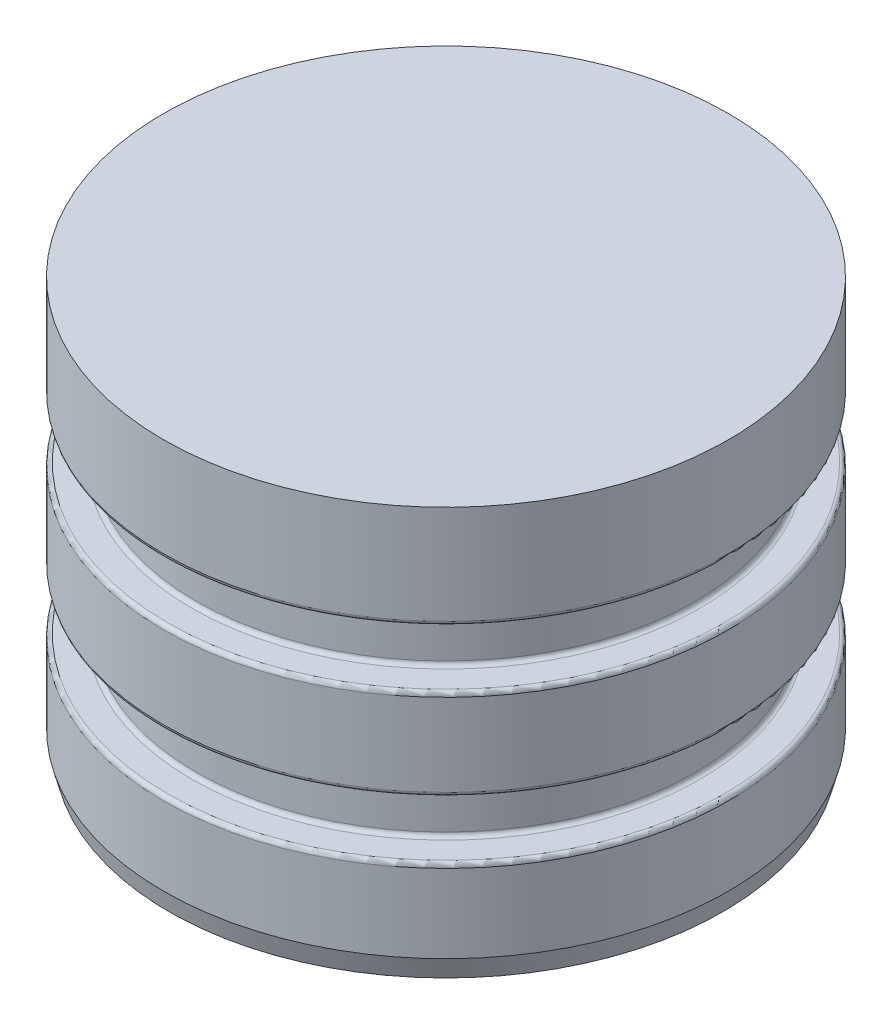
ISO-10303-21;
HEADER;
FILE_DESCRIPTION(('STEP AP214'),'2;1');
FILE_NAME('part.step','',(''),(''),'','','');
FILE_SCHEMA(('AUTOMOTIVE_DESIGN { 1 0 10303 214 1 1 1 1 }'));
ENDSEC;
DATA;
#1=APPLICATION_CONTEXT('core data for automotive mechanical design processes');
#2=APPLICATION_PROTOCOL_DEFINITION('international standard','automotive_design',2000,#1);
#3=PRODUCT_CONTEXT('',#1,'mechanical');
#4=PRODUCT('Part','Part','',(#3));
#5=PRODUCT_RELATED_PRODUCT_CATEGORY('part','',(#4));
#6=PRODUCT_DEFINITION_FORMATION('','',#4);
#7=PRODUCT_DEFINITION_CONTEXT('part definition',#1,'design');
#8=PRODUCT_DEFINITION('design','',#6,#7);
#9=PRODUCT_DEFINITION_SHAPE('','',#8);
#10=(LENGTH_UNIT() NAMED_UNIT(*) SI_UNIT(.MILLI.,.METRE.));
#11=(NAMED_UNIT(*) PLANE_ANGLE_UNIT() SI_UNIT($,.RADIAN.));
#12=(NAMED_UNIT(*) SI_UNIT($,.STERADIAN.) SOLID_ANGLE_UNIT());
#13=UNCERTAINTY_MEASURE_WITH_UNIT(LENGTH_MEASURE(1.E-05),#10,'distance_accuracy_value','');
#14=(GEOMETRIC_REPRESENTATION_CONTEXT(3) GLOBAL_UNCERTAINTY_ASSIGNED_CONTEXT((#13)) GLOBAL_UNIT_ASSIGNED_CONTEXT((#10,
#11,#12)) REPRESENTATION_CONTEXT('',''));
#15=CARTESIAN_POINT('',(0.,0.,0.));
#16=DIRECTION('',(0.,0.,1.));
#17=DIRECTION('',(1.,0.,0.));
#18=AXIS2_PLACEMENT_3D('',#15,#16,#17);
#19=CARTESIAN_POINT('',(0.,25.4,0.));
#20=DIRECTION('',(0.,1.,0.));
#21=DIRECTION('',(0.,0.,1.));
#22=AXIS2_PLACEMENT_3D('',#19,#20,#21);
#23=PLANE('',#22);
#24=CARTESIAN_POINT('',(0.,25.4,0.));
#25=DIRECTION('',(0.,1.,0.));
#26=DIRECTION('',(0.,0.,1.));
#27=AXIS2_PLACEMENT_3D('',#24,#25,#26);
#28=CIRCLE('',#27,17.4371);
#29=CARTESIAN_POINT('',(0.,25.4,17.4371));
#30=VERTEX_POINT('',#29);
#31=EDGE_CURVE('E97',#30,#30,#28,.T.);
#32=ORIENTED_EDGE('',*,*,#31,.T.);
#33=EDGE_LOOP('',(#32));
#34=FACE_BOUND('',#33,.T.);
#35=ADVANCED_FACE('F35',(#34),#23,.T.);
#36=CARTESIAN_POINT('',(0.,0.,0.));
#37=DIRECTION('',(0.,1.,0.));
#38=DIRECTION('',(0.,0.,1.));
#39=AXIS2_PLACEMENT_3D('',#36,#37,#38);
#40=CYLINDRICAL_SURFACE('',#39,17.4371);
#41=CARTESIAN_POINT('',(0.,19.304,0.));
#42=DIRECTION('',(0.,-1.,0.));
#43=DIRECTION('',(0.,0.,-1.));
#44=AXIS2_PLACEMENT_3D('',#41,#42,#43);
#45=CIRCLE('',#44,17.4371);
#46=CARTESIAN_POINT('',(0.,19.304,-17.4371));
#47=VERTEX_POINT('',#46);
#48=EDGE_CURVE('E67',#47,#47,#45,.F.);
#49=ORIENTED_EDGE('',*,*,#48,.T.);
#50=EDGE_LOOP('',(#49));
#51=FACE_BOUND('',#50,.T.);
#52=ORIENTED_EDGE('',*,*,#31,.F.);
#53=EDGE_LOOP('',(#52));
#54=FACE_BOUND('',#53,.T.);
#55=ADVANCED_FACE('F124',(#51,#54),#40,.T.);
#56=CARTESIAN_POINT('',(-17.4371,19.05,0.));
#57=DIRECTION('',(0.,-1.,0.));
#58=DIRECTION('',(0.,0.,-1.));
#59=AXIS2_PLACEMENT_3D('',#56,#57,#58);
#60=PLANE('',#59);
#61=CARTESIAN_POINT('',(0.,19.05,0.));
#62=DIRECTION('',(0.,-1.,0.));
#63=DIRECTION('',(0.,0.,-1.));
#64=AXIS2_PLACEMENT_3D('',#61,#62,#63);
#65=CIRCLE('',#64,17.1831);
#66=CARTESIAN_POINT('',(0.,19.05,-17.1831));
#67=VERTEX_POINT('',#66);
#68=EDGE_CURVE('E61',#67,#67,#65,.T.);
#69=ORIENTED_EDGE('',*,*,#68,.T.);
#70=EDGE_LOOP('',(#69));
#71=FACE_BOUND('',#70,.T.);
#72=CARTESIAN_POINT('',(0.,19.05,0.));
#73=DIRECTION('',(0.,-1.,0.));
#74=DIRECTION('',(0.,0.,-1.));
#75=AXIS2_PLACEMENT_3D('',#72,#73,#74);
#76=CIRCLE('',#75,15.6591);
#77=CARTESIAN_POINT('',(0.,19.05,-15.6591));
#78=VERTEX_POINT('',#77);
#79=EDGE_CURVE('E64',#78,#78,#76,.F.);
#80=ORIENTED_EDGE('',*,*,#79,.T.);
#81=EDGE_LOOP('',(#80));
#82=FACE_BOUND('',#81,.T.);
#83=ADVANCED_FACE('F130',(#71,#82),#60,.T.);
#84=CARTESIAN_POINT('',(0.,0.,0.));
#85=DIRECTION('',(0.,1.,0.));
#86=DIRECTION('',(0.,0.,1.));
#87=AXIS2_PLACEMENT_3D('',#84,#85,#86);
#88=CYLINDRICAL_SURFACE('',#87,15.4051);
#89=CARTESIAN_POINT('',(0.,15.748,0.));
#90=DIRECTION('',(0.,1.,0.));
#91=DIRECTION('',(0.,0.,1.));
#92=AXIS2_PLACEMENT_3D('',#89,#90,#91);
#93=CIRCLE('',#92,15.4051);
#94=CARTESIAN_POINT('',(0.,15.748,15.4051));
#95=VERTEX_POINT('',#94);
#96=EDGE_CURVE('E46',#95,#95,#93,.T.);
#97=ORIENTED_EDGE('',*,*,#96,.T.);
#98=EDGE_LOOP('',(#97));
#99=FACE_BOUND('',#98,.T.);
#100=CARTESIAN_POINT('',(0.,18.796,0.));
#101=DIRECTION('',(0.,-1.,0.));
#102=DIRECTION('',(0.,0.,-1.));
#103=AXIS2_PLACEMENT_3D('',#100,#101,#102);
#104=CIRCLE('',#103,15.4051);
#105=CARTESIAN_POINT('',(0.,18.796,-15.4051));
#106=VERTEX_POINT('',#105);
#107=EDGE_CURVE('E50',#106,#106,#104,.T.);
#108=ORIENTED_EDGE('',*,*,#107,.T.);
#109=EDGE_LOOP('',(#108));
#110=FACE_BOUND('',#109,.T.);
#111=ADVANCED_FACE('F174',(#99,#110),#88,.T.);
#112=CARTESIAN_POINT('',(-15.4051,15.494,0.));
#113=DIRECTION('',(0.,1.,0.));
#114=DIRECTION('',(0.,0.,1.));
#115=AXIS2_PLACEMENT_3D('',#112,#113,#114);
#116=PLANE('',#115);
#117=CARTESIAN_POINT('',(0.,15.494,0.));
#118=DIRECTION('',(0.,1.,0.));
#119=DIRECTION('',(0.,0.,1.));
#120=AXIS2_PLACEMENT_3D('',#117,#118,#119);
#121=CIRCLE('',#120,17.1831);
#122=CARTESIAN_POINT('',(0.,15.494,17.1831));
#123=VERTEX_POINT('',#122);
#124=EDGE_CURVE('E70',#123,#123,#121,.T.);
#125=ORIENTED_EDGE('',*,*,#124,.T.);
#126=EDGE_LOOP('',(#125));
#127=FACE_BOUND('',#126,.T.);
#128=CARTESIAN_POINT('',(0.,15.494,0.));
#129=DIRECTION('',(0.,1.,0.));
#130=DIRECTION('',(0.,0.,1.));
#131=AXIS2_PLACEMENT_3D('',#128,#129,#130);
#132=CIRCLE('',#131,15.6591);
#133=CARTESIAN_POINT('',(0.,15.494,15.6591));
#134=VERTEX_POINT('',#133);
#135=EDGE_CURVE('E73',#134,#134,#132,.F.);
#136=ORIENTED_EDGE('',*,*,#135,.T.);
#137=EDGE_LOOP('',(#136));
#138=FACE_BOUND('',#137,.T.);
#139=ADVANCED_FACE('F179',(#127,#138),#116,.T.);
#140=CARTESIAN_POINT('',(0.,0.,0.));
#141=DIRECTION('',(0.,1.,0.));
#142=DIRECTION('',(0.,0.,1.));
#143=AXIS2_PLACEMENT_3D('',#140,#141,#142);
#144=CYLINDRICAL_SURFACE('',#143,17.4371);
#145=CARTESIAN_POINT('',(0.,10.16,0.));
#146=DIRECTION('',(0.,-1.,0.));
#147=DIRECTION('',(0.,0.,-1.));
#148=AXIS2_PLACEMENT_3D('',#145,#146,#147);
#149=CIRCLE('',#148,17.4371);
#150=CARTESIAN_POINT('',(0.,10.16,-17.4371));
#151=VERTEX_POINT('',#150);
#152=EDGE_CURVE('E82',#151,#151,#149,.F.);
#153=ORIENTED_EDGE('',*,*,#152,.T.);
#154=EDGE_LOOP('',(#153));
#155=FACE_BOUND('',#154,.T.);
#156=CARTESIAN_POINT('',(0.,15.24,0.));
#157=DIRECTION('',(0.,1.,0.));
#158=DIRECTION('',(0.,0.,1.));
#159=AXIS2_PLACEMENT_3D('',#156,#157,#158);
#160=CIRCLE('',#159,17.4371);
#161=CARTESIAN_POINT('',(0.,15.24,17.4371));
#162=VERTEX_POINT('',#161);
#163=EDGE_CURVE('E85',#162,#162,#160,.F.);
#164=ORIENTED_EDGE('',*,*,#163,.T.);
#165=EDGE_LOOP('',(#164));
#166=FACE_BOUND('',#165,.T.);
#167=ADVANCED_FACE('F185',(#155,#166),#144,.T.);
#168=CARTESIAN_POINT('',(-17.4371,9.906,0.));
#169=DIRECTION('',(0.,-1.,0.));
#170=DIRECTION('',(0.,0.,-1.));
#171=AXIS2_PLACEMENT_3D('',#168,#169,#170);
#172=PLANE('',#171);
#173=CARTESIAN_POINT('',(0.,9.906,0.));
#174=DIRECTION('',(0.,-1.,0.));
#175=DIRECTION('',(0.,0.,-1.));
#176=AXIS2_PLACEMENT_3D('',#173,#174,#175);
#177=CIRCLE('',#176,17.1831);
#178=CARTESIAN_POINT('',(0.,9.906,-17.1831));
#179=VERTEX_POINT('',#178);
#180=EDGE_CURVE('E76',#179,#179,#177,.T.);
#181=ORIENTED_EDGE('',*,*,#180,.T.);
#182=EDGE_LOOP('',(#181));
#183=FACE_BOUND('',#182,.T.);
#184=CARTESIAN_POINT('',(0.,9.906,0.));
#185=DIRECTION('',(0.,-1.,0.));
#186=DIRECTION('',(0.,0.,-1.));
#187=AXIS2_PLACEMENT_3D('',#184,#185,#186);
#188=CIRCLE('',#187,15.6591);
#189=CARTESIAN_POINT('',(0.,9.906,-15.6591));
#190=VERTEX_POINT('',#189);
#191=EDGE_CURVE('E79',#190,#190,#188,.F.);
#192=ORIENTED_EDGE('',*,*,#191,.T.);
#193=EDGE_LOOP('',(#192));
#194=FACE_BOUND('',#193,.T.);
#195=ADVANCED_FACE('F189',(#183,#194),#172,.T.);
#196=CARTESIAN_POINT('',(0.,0.,0.));
#197=DIRECTION('',(0.,1.,0.));
#198=DIRECTION('',(0.,0.,1.));
#199=AXIS2_PLACEMENT_3D('',#196,#197,#198);
#200=CYLINDRICAL_SURFACE('',#199,15.4051);
#201=CARTESIAN_POINT('',(0.,6.604,0.));
#202=DIRECTION('',(0.,1.,0.));
#203=DIRECTION('',(0.,0.,1.));
#204=AXIS2_PLACEMENT_3D('',#201,#202,#203);
#205=CIRCLE('',#204,15.4051);
#206=CARTESIAN_POINT('',(0.,6.604,15.4051));
#207=VERTEX_POINT('',#206);
#208=EDGE_CURVE('E55',#207,#207,#205,.T.);
#209=ORIENTED_EDGE('',*,*,#208,.T.);
#210=EDGE_LOOP('',(#209));
#211=FACE_BOUND('',#210,.T.);
#212=CARTESIAN_POINT('',(0.,9.652,0.));
#213=DIRECTION('',(0.,-1.,0.));
#214=DIRECTION('',(0.,0.,-1.));
#215=AXIS2_PLACEMENT_3D('',#212,#213,#214);
#216=CIRCLE('',#215,15.4051);
#217=CARTESIAN_POINT('',(0.,9.652,-15.4051));
#218=VERTEX_POINT('',#217);
#219=EDGE_CURVE('E58',#218,#218,#216,.T.);
#220=ORIENTED_EDGE('',*,*,#219,.T.);
#221=EDGE_LOOP('',(#220));
#222=FACE_BOUND('',#221,.T.);
#223=ADVANCED_FACE('F193',(#211,#222),#200,.T.);
#224=CARTESIAN_POINT('',(-15.4051,6.35,0.));
#225=DIRECTION('',(0.,1.,0.));
#226=DIRECTION('',(0.,0.,1.));
#227=AXIS2_PLACEMENT_3D('',#224,#225,#226);
#228=PLANE('',#227);
#229=CARTESIAN_POINT('',(0.,6.35,0.));
#230=DIRECTION('',(0.,1.,0.));
#231=DIRECTION('',(0.,0.,1.));
#232=AXIS2_PLACEMENT_3D('',#229,#230,#231);
#233=CIRCLE('',#232,17.1831);
#234=CARTESIAN_POINT('',(0.,6.35,17.1831));
#235=VERTEX_POINT('',#234);
#236=EDGE_CURVE('E91',#235,#235,#233,.T.);
#237=ORIENTED_EDGE('',*,*,#236,.T.);
#238=EDGE_LOOP('',(#237));
#239=FACE_BOUND('',#238,.T.);
#240=CARTESIAN_POINT('',(0.,6.35,0.));
#241=DIRECTION('',(0.,1.,0.));
#242=DIRECTION('',(0.,0.,1.));
#243=AXIS2_PLACEMENT_3D('',#240,#241,#242);
#244=CIRCLE('',#243,15.6591);
#245=CARTESIAN_POINT('',(0.,6.35,15.6591));
#246=VERTEX_POINT('',#245);
#247=EDGE_CURVE('E94',#246,#246,#244,.F.);
#248=ORIENTED_EDGE('',*,*,#247,.T.);
#249=EDGE_LOOP('',(#248));
#250=FACE_BOUND('',#249,.T.);
#251=ADVANCED_FACE('F121',(#239,#250),#228,.T.);
#252=CARTESIAN_POINT('',(0.,0.,0.));
#253=DIRECTION('',(0.,1.,0.));
#254=DIRECTION('',(0.,0.,1.));
#255=AXIS2_PLACEMENT_3D('',#252,#253,#254);
#256=CYLINDRICAL_SURFACE('',#255,17.4371);
#257=CARTESIAN_POINT('',(0.,1.27000000000001,0.));
#258=DIRECTION('',(0.,-1.,0.));
#259=DIRECTION('',(0.,0.,-1.));
#260=AXIS2_PLACEMENT_3D('',#257,#258,#259);
#261=CIRCLE('',#260,17.4371);
#262=CARTESIAN_POINT('',(0.,1.27000000000001,-17.4371));
#263=VERTEX_POINT('',#262);
#264=EDGE_CURVE('E42',#263,#263,#261,.F.);
#265=ORIENTED_EDGE('',*,*,#264,.T.);
#266=EDGE_LOOP('',(#265));
#267=FACE_BOUND('',#266,.T.);
#268=CARTESIAN_POINT('',(0.,6.096,0.));
#269=DIRECTION('',(0.,1.,0.));
#270=DIRECTION('',(0.,0.,1.));
#271=AXIS2_PLACEMENT_3D('',#268,#269,#270);
#272=CIRCLE('',#271,17.4371);
#273=CARTESIAN_POINT('',(0.,6.096,17.4371));
#274=VERTEX_POINT('',#273);
#275=EDGE_CURVE('E88',#274,#274,#272,.F.);
#276=ORIENTED_EDGE('',*,*,#275,.T.);
#277=EDGE_LOOP('',(#276));
#278=FACE_BOUND('',#277,.T.);
#279=ADVANCED_FACE('F113',(#267,#278),#256,.T.);
#280=CARTESIAN_POINT('',(-17.4371,0.,0.));
#281=DIRECTION('',(0.,-1.,0.));
#282=DIRECTION('',(0.,0.,-1.));
#283=AXIS2_PLACEMENT_3D('',#280,#281,#282);
#284=PLANE('',#283);
#285=CARTESIAN_POINT('',(0.,0.,0.));
#286=DIRECTION('',(0.,-1.,0.));
#287=DIRECTION('',(0.,0.,-1.));
#288=AXIS2_PLACEMENT_3D('',#285,#286,#287);
#289=CIRCLE('',#288,17.0968045256125);
#290=CARTESIAN_POINT('',(0.,0.,-17.0968045256125));
#291=VERTEX_POINT('',#290);
#292=EDGE_CURVE('E11',#291,#291,#289,.T.);
#293=ORIENTED_EDGE('',*,*,#292,.T.);
#294=EDGE_LOOP('',(#293));
#295=FACE_BOUND('',#294,.T.);
#296=CARTESIAN_POINT('',(0.,0.,0.));
#297=DIRECTION('',(0.,-1.,0.));
#298=DIRECTION('',(0.,0.,-1.));
#299=AXIS2_PLACEMENT_3D('',#296,#297,#298);
#300=CIRCLE('',#299,8.763);
#301=CARTESIAN_POINT('',(0.,0.,-8.763));
#302=VERTEX_POINT('',#301);
#303=EDGE_CURVE('E103',#302,#302,#300,.T.);
#304=ORIENTED_EDGE('',*,*,#303,.F.);
#305=EDGE_LOOP('',(#304));
#306=FACE_BOUND('',#305,.T.);
#307=ADVANCED_FACE('F110',(#295,#306),#284,.T.);
#308=CARTESIAN_POINT('',(0.,22.098,0.));
#309=DIRECTION('',(0.,1.,0.));
#310=DIRECTION('',(0.,0.,1.));
#311=AXIS2_PLACEMENT_3D('',#308,#309,#310);
#312=PLANE('',#311);
#313=CARTESIAN_POINT('',(0.,22.098,0.));
#314=DIRECTION('',(0.,1.,0.));
#315=DIRECTION('',(0.,0.,1.));
#316=AXIS2_PLACEMENT_3D('',#313,#314,#315);
#317=CIRCLE('',#316,8.763);
#318=CARTESIAN_POINT('',(0.,22.098,8.763));
#319=VERTEX_POINT('',#318);
#320=EDGE_CURVE('E100',#319,#319,#317,.F.);
#321=ORIENTED_EDGE('',*,*,#320,.T.);
#322=EDGE_LOOP('',(#321));
#323=FACE_BOUND('',#322,.T.);
#324=ADVANCED_FACE('F112',(#323),#312,.F.);
#325=CARTESIAN_POINT('',(0.,50.1855068941509,0.));
#326=DIRECTION('',(0.,-1.,0.));
#327=DIRECTION('',(0.,0.,-1.));
#328=AXIS2_PLACEMENT_3D('',#325,#326,#327);
#329=CYLINDRICAL_SURFACE('',#328,8.763);
#330=ORIENTED_EDGE('',*,*,#303,.T.);
#331=EDGE_LOOP('',(#330));
#332=FACE_BOUND('',#331,.T.);
#333=ORIENTED_EDGE('',*,*,#320,.F.);
#334=EDGE_LOOP('',(#333));
#335=FACE_BOUND('',#334,.T.);
#336=ADVANCED_FACE('F107',(#332,#335),#329,.F.);
#337=CARTESIAN_POINT('',(0.,6.096,0.));
#338=DIRECTION('',(0.,1.,0.));
#339=DIRECTION('',(0.,0.,1.));
#340=AXIS2_PLACEMENT_3D('',#337,#338,#339);
#341=TOROIDAL_SURFACE('',#340,17.1831,0.254);
#342=ORIENTED_EDGE('',*,*,#275,.F.);
#343=EDGE_LOOP('',(#342));
#344=FACE_BOUND('',#343,.T.);
#345=ORIENTED_EDGE('',*,*,#236,.F.);
#346=EDGE_LOOP('',(#345));
#347=FACE_BOUND('',#346,.T.);
#348=ADVANCED_FACE('F135',(#344,#347),#341,.T.);
#349=CARTESIAN_POINT('',(0.,10.16,0.));
#350=DIRECTION('',(0.,-1.,0.));
#351=DIRECTION('',(0.,0.,-1.));
#352=AXIS2_PLACEMENT_3D('',#349,#350,#351);
#353=TOROIDAL_SURFACE('',#352,17.1831,0.254);
#354=ORIENTED_EDGE('',*,*,#180,.F.);
#355=EDGE_LOOP('',(#354));
#356=FACE_BOUND('',#355,.T.);
#357=ORIENTED_EDGE('',*,*,#152,.F.);
#358=EDGE_LOOP('',(#357));
#359=FACE_BOUND('',#358,.T.);
#360=ADVANCED_FACE('F138',(#356,#359),#353,.T.);
#361=CARTESIAN_POINT('',(0.,15.24,0.));
#362=DIRECTION('',(0.,1.,0.));
#363=DIRECTION('',(0.,0.,1.));
#364=AXIS2_PLACEMENT_3D('',#361,#362,#363);
#365=TOROIDAL_SURFACE('',#364,17.1831,0.254);
#366=ORIENTED_EDGE('',*,*,#163,.F.);
#367=EDGE_LOOP('',(#366));
#368=FACE_BOUND('',#367,.T.);
#369=ORIENTED_EDGE('',*,*,#124,.F.);
#370=EDGE_LOOP('',(#369));
#371=FACE_BOUND('',#370,.T.);
#372=ADVANCED_FACE('F142',(#368,#371),#365,.T.);
#373=CARTESIAN_POINT('',(0.,19.304,0.));
#374=DIRECTION('',(0.,-1.,0.));
#375=DIRECTION('',(0.,0.,-1.));
#376=AXIS2_PLACEMENT_3D('',#373,#374,#375);
#377=TOROIDAL_SURFACE('',#376,17.1831,0.254);
#378=ORIENTED_EDGE('',*,*,#68,.F.);
#379=EDGE_LOOP('',(#378));
#380=FACE_BOUND('',#379,.T.);
#381=ORIENTED_EDGE('',*,*,#48,.F.);
#382=EDGE_LOOP('',(#381));
#383=FACE_BOUND('',#382,.T.);
#384=ADVANCED_FACE('F146',(#380,#383),#377,.T.);
#385=CARTESIAN_POINT('',(0.,6.604,0.));
#386=DIRECTION('',(0.,1.,0.));
#387=DIRECTION('',(0.,0.,1.));
#388=AXIS2_PLACEMENT_3D('',#385,#386,#387);
#389=TOROIDAL_SURFACE('',#388,15.6591,0.254);
#390=ORIENTED_EDGE('',*,*,#247,.F.);
#391=EDGE_LOOP('',(#390));
#392=FACE_BOUND('',#391,.T.);
#393=ORIENTED_EDGE('',*,*,#208,.F.);
#394=EDGE_LOOP('',(#393));
#395=FACE_BOUND('',#394,.T.);
#396=ADVANCED_FACE('F150',(#392,#395),#389,.F.);
#397=CARTESIAN_POINT('',(0.,9.652,0.));
#398=DIRECTION('',(0.,-1.,0.));
#399=DIRECTION('',(0.,0.,-1.));
#400=AXIS2_PLACEMENT_3D('',#397,#398,#399);
#401=TOROIDAL_SURFACE('',#400,15.6591,0.254);
#402=ORIENTED_EDGE('',*,*,#219,.F.);
#403=EDGE_LOOP('',(#402));
#404=FACE_BOUND('',#403,.T.);
#405=ORIENTED_EDGE('',*,*,#191,.F.);
#406=EDGE_LOOP('',(#405));
#407=FACE_BOUND('',#406,.T.);
#408=ADVANCED_FACE('F154',(#404,#407),#401,.F.);
#409=CARTESIAN_POINT('',(0.,15.748,0.));
#410=DIRECTION('',(0.,1.,0.));
#411=DIRECTION('',(0.,0.,1.));
#412=AXIS2_PLACEMENT_3D('',#409,#410,#411);
#413=TOROIDAL_SURFACE('',#412,15.6591,0.254);
#414=ORIENTED_EDGE('',*,*,#135,.F.);
#415=EDGE_LOOP('',(#414));
#416=FACE_BOUND('',#415,.T.);
#417=ORIENTED_EDGE('',*,*,#96,.F.);
#418=EDGE_LOOP('',(#417));
#419=FACE_BOUND('',#418,.T.);
#420=ADVANCED_FACE('F158',(#416,#419),#413,.F.);
#421=CARTESIAN_POINT('',(0.,18.796,0.));
#422=DIRECTION('',(0.,-1.,0.));
#423=DIRECTION('',(0.,0.,-1.));
#424=AXIS2_PLACEMENT_3D('',#421,#422,#423);
#425=TOROIDAL_SURFACE('',#424,15.6591,0.254);
#426=ORIENTED_EDGE('',*,*,#107,.F.);
#427=EDGE_LOOP('',(#426));
#428=FACE_BOUND('',#427,.T.);
#429=ORIENTED_EDGE('',*,*,#79,.F.);
#430=EDGE_LOOP('',(#429));
#431=FACE_BOUND('',#430,.T.);
#432=ADVANCED_FACE('F161',(#428,#431),#425,.F.);
#433=CARTESIAN_POINT('',(0.,1.27000000000001,0.));
#434=DIRECTION('',(0.,1.,0.));
#435=DIRECTION('',(0.,0.,1.));
#436=AXIS2_PLACEMENT_3D('',#433,#434,#435);
#437=CONICAL_SURFACE('',#436,17.4371,0.261799387799149);
#438=ORIENTED_EDGE('',*,*,#292,.F.);
#439=EDGE_LOOP('',(#438));
#440=FACE_BOUND('',#439,.T.);
#441=ORIENTED_EDGE('',*,*,#264,.F.);
#442=EDGE_LOOP('',(#441));
#443=FACE_BOUND('',#442,.T.);
#444=ADVANCED_FACE('F37',(#440,#443),#437,.T.);
#445=CLOSED_SHELL('',(#35,#55,#83,#111,#139,#167,#195,#223,#251,#279,#307,#324,#336,#348,#360,
#372,#384,#396,#408,#420,#432,#444));
#446=MANIFOLD_SOLID_BREP('B2',#445);
#447=ADVANCED_BREP_SHAPE_REPRESENTATION('',(#18,#446),#14);
#448=SHAPE_DEFINITION_REPRESENTATION(#9,#447);
ENDSEC;
END-ISO-10303-21;
